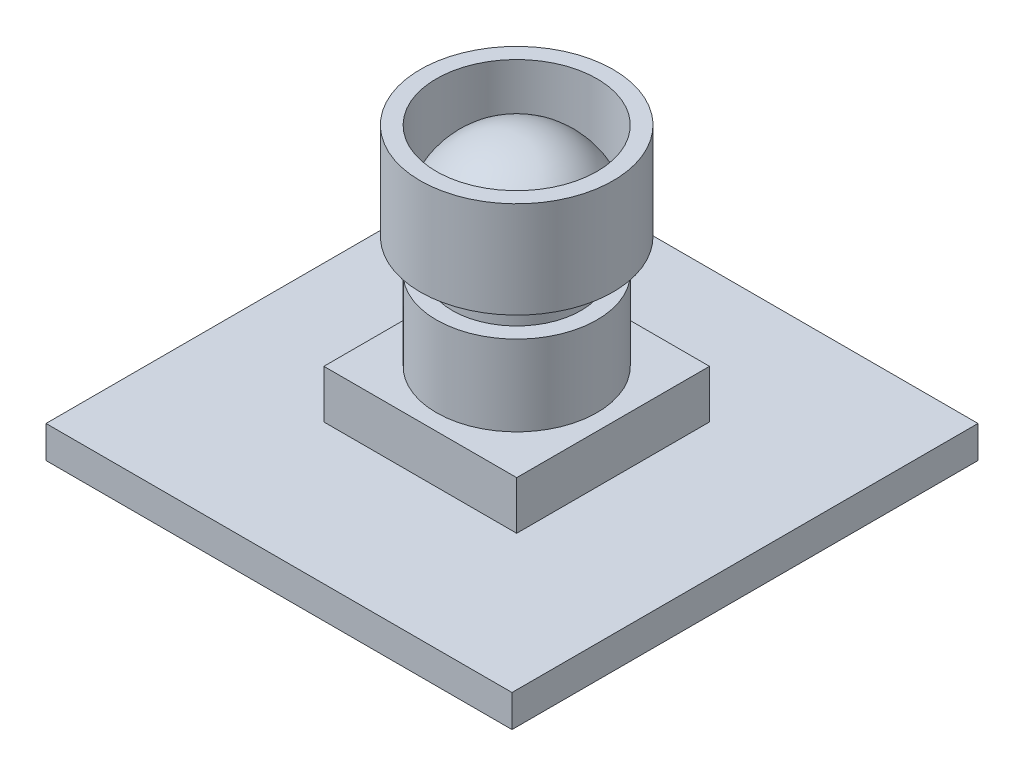
ISO-10303-21;
HEADER;
FILE_DESCRIPTION(('STEP AP214'),'2;1');
FILE_NAME('part.step','',(''),(''),'','','');
FILE_SCHEMA(('AUTOMOTIVE_DESIGN { 1 0 10303 214 1 1 1 1 }'));
ENDSEC;
DATA;
#1=APPLICATION_CONTEXT('core data for automotive mechanical design processes');
#2=APPLICATION_PROTOCOL_DEFINITION('international standard','automotive_design',2000,#1);
#3=PRODUCT_CONTEXT('',#1,'mechanical');
#4=PRODUCT('Part','Part','',(#3));
#5=PRODUCT_RELATED_PRODUCT_CATEGORY('part','',(#4));
#6=PRODUCT_DEFINITION_FORMATION('','',#4);
#7=PRODUCT_DEFINITION_CONTEXT('part definition',#1,'design');
#8=PRODUCT_DEFINITION('design','',#6,#7);
#9=PRODUCT_DEFINITION_SHAPE('','',#8);
#10=(LENGTH_UNIT() NAMED_UNIT(*) SI_UNIT(.MILLI.,.METRE.));
#11=(NAMED_UNIT(*) PLANE_ANGLE_UNIT() SI_UNIT($,.RADIAN.));
#12=(NAMED_UNIT(*) SI_UNIT($,.STERADIAN.) SOLID_ANGLE_UNIT());
#13=UNCERTAINTY_MEASURE_WITH_UNIT(LENGTH_MEASURE(1.E-05),#10,'distance_accuracy_value','');
#14=(GEOMETRIC_REPRESENTATION_CONTEXT(3) GLOBAL_UNCERTAINTY_ASSIGNED_CONTEXT((#13)) GLOBAL_UNIT_ASSIGNED_CONTEXT((#10,
#11,#12)) REPRESENTATION_CONTEXT('',''));
#15=CARTESIAN_POINT('',(0.,0.,0.));
#16=DIRECTION('',(0.,0.,1.));
#17=DIRECTION('',(1.,0.,0.));
#18=AXIS2_PLACEMENT_3D('',#15,#16,#17);
#19=CARTESIAN_POINT('',(0.,2.,0.));
#20=DIRECTION('',(0.,-1.,0.));
#21=DIRECTION('',(0.,0.,-1.));
#22=AXIS2_PLACEMENT_3D('',#19,#20,#21);
#23=PLANE('',#22);
#24=DIRECTION('',(0.,0.,1.));
#25=VECTOR('',#24,1.);
#26=CARTESIAN_POINT('',(0.,2.,0.));
#27=LINE('',#26,#25);
#28=CARTESIAN_POINT('',(0.,2.,-29.));
#29=VERTEX_POINT('',#28);
#30=CARTESIAN_POINT('',(0.,2.,0.));
#31=VERTEX_POINT('',#30);
#32=EDGE_CURVE('E147',#29,#31,#27,.T.);
#33=ORIENTED_EDGE('',*,*,#32,.T.);
#34=DIRECTION('',(1.,0.,0.));
#35=VECTOR('',#34,1.);
#36=CARTESIAN_POINT('',(0.,2.,0.));
#37=LINE('',#36,#35);
#38=CARTESIAN_POINT('',(29.,2.,0.));
#39=VERTEX_POINT('',#38);
#40=EDGE_CURVE('E151',#31,#39,#37,.T.);
#41=ORIENTED_EDGE('',*,*,#40,.T.);
#42=DIRECTION('',(0.,0.,-1.));
#43=VECTOR('',#42,1.);
#44=CARTESIAN_POINT('',(29.,2.,0.));
#45=LINE('',#44,#43);
#46=CARTESIAN_POINT('',(29.,2.,-29.));
#47=VERTEX_POINT('',#46);
#48=EDGE_CURVE('E155',#39,#47,#45,.T.);
#49=ORIENTED_EDGE('',*,*,#48,.T.);
#50=DIRECTION('',(-1.,0.,0.));
#51=VECTOR('',#50,1.);
#52=CARTESIAN_POINT('',(0.,2.,-29.));
#53=LINE('',#52,#51);
#54=EDGE_CURVE('E158',#47,#29,#53,.T.);
#55=ORIENTED_EDGE('',*,*,#54,.T.);
#56=EDGE_LOOP('',(#33,#41,#49,#55));
#57=FACE_BOUND('',#56,.T.);
#58=DIRECTION('',(0.,0.,1.));
#59=VECTOR('',#58,1.);
#60=CARTESIAN_POINT('',(8.56637487316948,2.,-20.725607830169));
#61=LINE('',#60,#59);
#62=CARTESIAN_POINT('',(8.56637487316948,2.,-20.725607830169));
#63=VERTEX_POINT('',#62);
#64=CARTESIAN_POINT('',(8.56637487316948,2.,-8.72560783016905));
#65=VERTEX_POINT('',#64);
#66=EDGE_CURVE('E63',#63,#65,#61,.T.);
#67=ORIENTED_EDGE('',*,*,#66,.F.);
#68=DIRECTION('',(-1.,0.,0.));
#69=VECTOR('',#68,1.);
#70=CARTESIAN_POINT('',(8.56637487316948,2.,-20.725607830169));
#71=LINE('',#70,#69);
#72=CARTESIAN_POINT('',(20.5663748731695,2.,-20.725607830169));
#73=VERTEX_POINT('',#72);
#74=EDGE_CURVE('E67',#73,#63,#71,.T.);
#75=ORIENTED_EDGE('',*,*,#74,.F.);
#76=DIRECTION('',(0.,0.,-1.));
#77=VECTOR('',#76,1.);
#78=CARTESIAN_POINT('',(20.5663748731695,2.,-20.725607830169));
#79=LINE('',#78,#77);
#80=CARTESIAN_POINT('',(20.5663748731695,2.,-8.72560783016905));
#81=VERTEX_POINT('',#80);
#82=EDGE_CURVE('E204',#81,#73,#79,.T.);
#83=ORIENTED_EDGE('',*,*,#82,.F.);
#84=DIRECTION('',(1.,0.,0.));
#85=VECTOR('',#84,1.);
#86=CARTESIAN_POINT('',(8.56637487316948,2.,-8.72560783016905));
#87=LINE('',#86,#85);
#88=EDGE_CURVE('E201',#65,#81,#87,.T.);
#89=ORIENTED_EDGE('',*,*,#88,.F.);
#90=EDGE_LOOP('',(#67,#75,#83,#89));
#91=FACE_BOUND('',#90,.T.);
#92=ADVANCED_FACE('F45',(#57,#91),#23,.F.);
#93=CARTESIAN_POINT('',(0.,2.,0.));
#94=DIRECTION('',(1.,0.,0.));
#95=DIRECTION('',(0.,0.,-1.));
#96=AXIS2_PLACEMENT_3D('',#93,#94,#95);
#97=PLANE('',#96);
#98=DIRECTION('',(0.,0.,1.));
#99=VECTOR('',#98,1.);
#100=CARTESIAN_POINT('',(0.,0.,0.));
#101=LINE('',#100,#99);
#102=CARTESIAN_POINT('',(0.,0.,-29.));
#103=VERTEX_POINT('',#102);
#104=CARTESIAN_POINT('',(0.,0.,0.));
#105=VERTEX_POINT('',#104);
#106=EDGE_CURVE('E136',#103,#105,#101,.T.);
#107=ORIENTED_EDGE('',*,*,#106,.T.);
#108=DIRECTION('',(0.,-1.,0.));
#109=VECTOR('',#108,1.);
#110=CARTESIAN_POINT('',(0.,2.,0.));
#111=LINE('',#110,#109);
#112=EDGE_CURVE('E49',#31,#105,#111,.T.);
#113=ORIENTED_EDGE('',*,*,#112,.F.);
#114=ORIENTED_EDGE('',*,*,#32,.F.);
#115=DIRECTION('',(0.,-1.,0.));
#116=VECTOR('',#115,1.);
#117=CARTESIAN_POINT('',(0.,2.,-29.));
#118=LINE('',#117,#116);
#119=EDGE_CURVE('E160',#29,#103,#118,.T.);
#120=ORIENTED_EDGE('',*,*,#119,.T.);
#121=EDGE_LOOP('',(#107,#113,#114,#120));
#122=FACE_BOUND('',#121,.T.);
#123=ADVANCED_FACE('F47',(#122),#97,.F.);
#124=CARTESIAN_POINT('',(0.,2.,0.));
#125=DIRECTION('',(0.,0.,-1.));
#126=DIRECTION('',(-1.,0.,0.));
#127=AXIS2_PLACEMENT_3D('',#124,#125,#126);
#128=PLANE('',#127);
#129=DIRECTION('',(1.,0.,0.));
#130=VECTOR('',#129,1.);
#131=CARTESIAN_POINT('',(0.,0.,0.));
#132=LINE('',#131,#130);
#133=CARTESIAN_POINT('',(29.,0.,0.));
#134=VERTEX_POINT('',#133);
#135=EDGE_CURVE('E141',#105,#134,#132,.T.);
#136=ORIENTED_EDGE('',*,*,#135,.T.);
#137=DIRECTION('',(0.,-1.,0.));
#138=VECTOR('',#137,1.);
#139=CARTESIAN_POINT('',(29.,2.,0.));
#140=LINE('',#139,#138);
#141=EDGE_CURVE('E175',#39,#134,#140,.T.);
#142=ORIENTED_EDGE('',*,*,#141,.F.);
#143=ORIENTED_EDGE('',*,*,#40,.F.);
#144=ORIENTED_EDGE('',*,*,#112,.T.);
#145=EDGE_LOOP('',(#136,#142,#143,#144));
#146=FACE_BOUND('',#145,.T.);
#147=ADVANCED_FACE('F223',(#146),#128,.F.);
#148=CARTESIAN_POINT('',(29.,2.,0.));
#149=DIRECTION('',(-1.,0.,0.));
#150=DIRECTION('',(0.,0.,1.));
#151=AXIS2_PLACEMENT_3D('',#148,#149,#150);
#152=PLANE('',#151);
#153=DIRECTION('',(0.,0.,-1.));
#154=VECTOR('',#153,1.);
#155=CARTESIAN_POINT('',(29.,0.,0.));
#156=LINE('',#155,#154);
#157=CARTESIAN_POINT('',(29.,0.,-29.));
#158=VERTEX_POINT('',#157);
#159=EDGE_CURVE('E164',#134,#158,#156,.T.);
#160=ORIENTED_EDGE('',*,*,#159,.T.);
#161=DIRECTION('',(0.,-1.,0.));
#162=VECTOR('',#161,1.);
#163=CARTESIAN_POINT('',(29.,2.,-29.));
#164=LINE('',#163,#162);
#165=EDGE_CURVE('E172',#47,#158,#164,.T.);
#166=ORIENTED_EDGE('',*,*,#165,.F.);
#167=ORIENTED_EDGE('',*,*,#48,.F.);
#168=ORIENTED_EDGE('',*,*,#141,.T.);
#169=EDGE_LOOP('',(#160,#166,#167,#168));
#170=FACE_BOUND('',#169,.T.);
#171=ADVANCED_FACE('F235',(#170),#152,.F.);
#172=CARTESIAN_POINT('',(0.,2.,-29.));
#173=DIRECTION('',(0.,0.,1.));
#174=DIRECTION('',(1.,0.,0.));
#175=AXIS2_PLACEMENT_3D('',#172,#173,#174);
#176=PLANE('',#175);
#177=DIRECTION('',(-1.,0.,0.));
#178=VECTOR('',#177,1.);
#179=CARTESIAN_POINT('',(0.,0.,-29.));
#180=LINE('',#179,#178);
#181=EDGE_CURVE('E152',#158,#103,#180,.T.);
#182=ORIENTED_EDGE('',*,*,#181,.T.);
#183=ORIENTED_EDGE('',*,*,#119,.F.);
#184=ORIENTED_EDGE('',*,*,#54,.F.);
#185=ORIENTED_EDGE('',*,*,#165,.T.);
#186=EDGE_LOOP('',(#182,#183,#184,#185));
#187=FACE_BOUND('',#186,.T.);
#188=ADVANCED_FACE('F231',(#187),#176,.F.);
#189=CARTESIAN_POINT('',(0.,0.,0.));
#190=DIRECTION('',(0.,-1.,0.));
#191=DIRECTION('',(0.,0.,-1.));
#192=AXIS2_PLACEMENT_3D('',#189,#190,#191);
#193=PLANE('',#192);
#194=ORIENTED_EDGE('',*,*,#106,.F.);
#195=ORIENTED_EDGE('',*,*,#181,.F.);
#196=ORIENTED_EDGE('',*,*,#159,.F.);
#197=ORIENTED_EDGE('',*,*,#135,.F.);
#198=EDGE_LOOP('',(#194,#195,#196,#197));
#199=FACE_BOUND('',#198,.T.);
#200=ADVANCED_FACE('F228',(#199),#193,.T.);
#201=CARTESIAN_POINT('',(8.56637487316948,5.,-20.725607830169));
#202=DIRECTION('',(1.,0.,0.));
#203=DIRECTION('',(0.,0.,-1.));
#204=AXIS2_PLACEMENT_3D('',#201,#202,#203);
#205=PLANE('',#204);
#206=ORIENTED_EDGE('',*,*,#66,.T.);
#207=DIRECTION('',(0.,-1.,0.));
#208=VECTOR('',#207,1.);
#209=CARTESIAN_POINT('',(8.56637487316948,5.,-8.72560783016905));
#210=LINE('',#209,#208);
#211=CARTESIAN_POINT('',(8.56637487316948,5.,-8.72560783016905));
#212=VERTEX_POINT('',#211);
#213=EDGE_CURVE('E116',#212,#65,#210,.T.);
#214=ORIENTED_EDGE('',*,*,#213,.F.);
#215=DIRECTION('',(0.,0.,1.));
#216=VECTOR('',#215,1.);
#217=CARTESIAN_POINT('',(8.56637487316948,5.,-20.725607830169));
#218=LINE('',#217,#216);
#219=CARTESIAN_POINT('',(8.56637487316948,5.,-20.725607830169));
#220=VERTEX_POINT('',#219);
#221=EDGE_CURVE('E123',#220,#212,#218,.T.);
#222=ORIENTED_EDGE('',*,*,#221,.F.);
#223=DIRECTION('',(0.,-1.,0.));
#224=VECTOR('',#223,1.);
#225=CARTESIAN_POINT('',(8.56637487316948,5.,-20.725607830169));
#226=LINE('',#225,#224);
#227=EDGE_CURVE('E198',#220,#63,#226,.T.);
#228=ORIENTED_EDGE('',*,*,#227,.T.);
#229=EDGE_LOOP('',(#206,#214,#222,#228));
#230=FACE_BOUND('',#229,.T.);
#231=ADVANCED_FACE('F134',(#230),#205,.F.);
#232=CARTESIAN_POINT('',(8.56637487316948,5.,-8.72560783016905));
#233=DIRECTION('',(0.,0.,-1.));
#234=DIRECTION('',(-1.,0.,0.));
#235=AXIS2_PLACEMENT_3D('',#232,#233,#234);
#236=PLANE('',#235);
#237=ORIENTED_EDGE('',*,*,#88,.T.);
#238=DIRECTION('',(0.,-1.,0.));
#239=VECTOR('',#238,1.);
#240=CARTESIAN_POINT('',(20.5663748731695,5.,-8.72560783016905));
#241=LINE('',#240,#239);
#242=CARTESIAN_POINT('',(20.5663748731695,5.,-8.72560783016905));
#243=VERTEX_POINT('',#242);
#244=EDGE_CURVE('E118',#243,#81,#241,.T.);
#245=ORIENTED_EDGE('',*,*,#244,.F.);
#246=DIRECTION('',(1.,0.,0.));
#247=VECTOR('',#246,1.);
#248=CARTESIAN_POINT('',(8.56637487316948,5.,-8.72560783016905));
#249=LINE('',#248,#247);
#250=EDGE_CURVE('E111',#212,#243,#249,.T.);
#251=ORIENTED_EDGE('',*,*,#250,.F.);
#252=ORIENTED_EDGE('',*,*,#213,.T.);
#253=EDGE_LOOP('',(#237,#245,#251,#252));
#254=FACE_BOUND('',#253,.T.);
#255=ADVANCED_FACE('F114',(#254),#236,.F.);
#256=CARTESIAN_POINT('',(20.5663748731695,5.,-20.725607830169));
#257=DIRECTION('',(-1.,0.,0.));
#258=DIRECTION('',(0.,0.,1.));
#259=AXIS2_PLACEMENT_3D('',#256,#257,#258);
#260=PLANE('',#259);
#261=ORIENTED_EDGE('',*,*,#82,.T.);
#262=DIRECTION('',(0.,-1.,0.));
#263=VECTOR('',#262,1.);
#264=CARTESIAN_POINT('',(20.5663748731695,5.,-20.725607830169));
#265=LINE('',#264,#263);
#266=CARTESIAN_POINT('',(20.5663748731695,5.,-20.725607830169));
#267=VERTEX_POINT('',#266);
#268=EDGE_CURVE('E143',#267,#73,#265,.T.);
#269=ORIENTED_EDGE('',*,*,#268,.F.);
#270=DIRECTION('',(0.,0.,-1.));
#271=VECTOR('',#270,1.);
#272=CARTESIAN_POINT('',(20.5663748731695,5.,-20.725607830169));
#273=LINE('',#272,#271);
#274=EDGE_CURVE('E122',#243,#267,#273,.T.);
#275=ORIENTED_EDGE('',*,*,#274,.F.);
#276=ORIENTED_EDGE('',*,*,#244,.T.);
#277=EDGE_LOOP('',(#261,#269,#275,#276));
#278=FACE_BOUND('',#277,.T.);
#279=ADVANCED_FACE('F216',(#278),#260,.F.);
#280=CARTESIAN_POINT('',(8.56637487316948,5.,-20.725607830169));
#281=DIRECTION('',(0.,0.,1.));
#282=DIRECTION('',(1.,0.,0.));
#283=AXIS2_PLACEMENT_3D('',#280,#281,#282);
#284=PLANE('',#283);
#285=ORIENTED_EDGE('',*,*,#74,.T.);
#286=ORIENTED_EDGE('',*,*,#227,.F.);
#287=DIRECTION('',(-1.,0.,0.));
#288=VECTOR('',#287,1.);
#289=CARTESIAN_POINT('',(8.56637487316948,5.,-20.725607830169));
#290=LINE('',#289,#288);
#291=EDGE_CURVE('E128',#267,#220,#290,.T.);
#292=ORIENTED_EDGE('',*,*,#291,.F.);
#293=ORIENTED_EDGE('',*,*,#268,.T.);
#294=EDGE_LOOP('',(#285,#286,#292,#293));
#295=FACE_BOUND('',#294,.T.);
#296=ADVANCED_FACE('F214',(#295),#284,.F.);
#297=CARTESIAN_POINT('',(0.,5.,0.));
#298=DIRECTION('',(0.,1.,0.));
#299=DIRECTION('',(0.,0.,1.));
#300=AXIS2_PLACEMENT_3D('',#297,#298,#299);
#301=PLANE('',#300);
#302=CARTESIAN_POINT('',(14.5663748731695,5.,-14.725607830169));
#303=DIRECTION('',(0.,1.,0.));
#304=DIRECTION('',(0.,0.,1.));
#305=AXIS2_PLACEMENT_3D('',#302,#303,#304);
#306=CIRCLE('',#305,5.);
#307=CARTESIAN_POINT('',(14.5663748731695,5.,-9.72560783016905));
#308=VERTEX_POINT('',#307);
#309=EDGE_CURVE('E55',#308,#308,#306,.T.);
#310=ORIENTED_EDGE('',*,*,#309,.F.);
#311=EDGE_LOOP('',(#310));
#312=FACE_BOUND('',#311,.T.);
#313=ORIENTED_EDGE('',*,*,#221,.T.);
#314=ORIENTED_EDGE('',*,*,#250,.T.);
#315=ORIENTED_EDGE('',*,*,#274,.T.);
#316=ORIENTED_EDGE('',*,*,#291,.T.);
#317=EDGE_LOOP('',(#313,#314,#315,#316));
#318=FACE_BOUND('',#317,.T.);
#319=ADVANCED_FACE('F126',(#312,#318),#301,.T.);
#320=CARTESIAN_POINT('',(14.5663748731695,10.,-14.725607830169));
#321=DIRECTION('',(0.,-1.,0.));
#322=DIRECTION('',(0.,0.,-1.));
#323=AXIS2_PLACEMENT_3D('',#320,#321,#322);
#324=CYLINDRICAL_SURFACE('',#323,5.);
#325=CARTESIAN_POINT('',(14.5663748731695,10.,-14.725607830169));
#326=DIRECTION('',(0.,1.,0.));
#327=DIRECTION('',(0.,0.,1.));
#328=AXIS2_PLACEMENT_3D('',#325,#326,#327);
#329=CIRCLE('',#328,5.);
#330=CARTESIAN_POINT('',(14.5663748731695,10.,-9.72560783016905));
#331=VERTEX_POINT('',#330);
#332=EDGE_CURVE('E192',#331,#331,#329,.T.);
#333=ORIENTED_EDGE('',*,*,#332,.F.);
#334=EDGE_LOOP('',(#333));
#335=FACE_BOUND('',#334,.T.);
#336=ORIENTED_EDGE('',*,*,#309,.T.);
#337=EDGE_LOOP('',(#336));
#338=FACE_BOUND('',#337,.T.);
#339=ADVANCED_FACE('F289',(#335,#338),#324,.T.);
#340=CARTESIAN_POINT('',(14.5663748731695,10.,-14.725607830169));
#341=DIRECTION('',(0.,1.,0.));
#342=DIRECTION('',(0.,0.,1.));
#343=AXIS2_PLACEMENT_3D('',#340,#341,#342);
#344=PLANE('',#343);
#345=CARTESIAN_POINT('',(14.5663748731695,10.,-14.725607830169));
#346=DIRECTION('',(0.,1.,0.));
#347=DIRECTION('',(0.,0.,1.));
#348=AXIS2_PLACEMENT_3D('',#345,#346,#347);
#349=CIRCLE('',#348,4.);
#350=CARTESIAN_POINT('',(14.5663748731695,10.,-10.7256078301691));
#351=VERTEX_POINT('',#350);
#352=EDGE_CURVE('E12',#351,#351,#349,.T.);
#353=ORIENTED_EDGE('',*,*,#352,.F.);
#354=EDGE_LOOP('',(#353));
#355=FACE_BOUND('',#354,.T.);
#356=ORIENTED_EDGE('',*,*,#332,.T.);
#357=EDGE_LOOP('',(#356));
#358=FACE_BOUND('',#357,.T.);
#359=ADVANCED_FACE('F297',(#355,#358),#344,.T.);
#360=CARTESIAN_POINT('',(14.5663748731695,12.,-14.725607830169));
#361=DIRECTION('',(0.,-1.,0.));
#362=DIRECTION('',(0.,0.,-1.));
#363=AXIS2_PLACEMENT_3D('',#360,#361,#362);
#364=CYLINDRICAL_SURFACE('',#363,4.);
#365=CARTESIAN_POINT('',(14.5663748731695,12.,-14.725607830169));
#366=DIRECTION('',(0.,1.,0.));
#367=DIRECTION('',(0.,0.,1.));
#368=AXIS2_PLACEMENT_3D('',#365,#366,#367);
#369=CIRCLE('',#368,4.);
#370=CARTESIAN_POINT('',(14.5663748731695,12.,-10.7256078301691));
#371=VERTEX_POINT('',#370);
#372=EDGE_CURVE('E416',#371,#371,#369,.T.);
#373=ORIENTED_EDGE('',*,*,#372,.F.);
#374=EDGE_LOOP('',(#373));
#375=FACE_BOUND('',#374,.T.);
#376=ORIENTED_EDGE('',*,*,#352,.T.);
#377=EDGE_LOOP('',(#376));
#378=FACE_BOUND('',#377,.T.);
#379=ADVANCED_FACE('F305',(#375,#378),#364,.T.);
#380=CARTESIAN_POINT('',(14.5663748731695,12.,-14.725607830169));
#381=DIRECTION('',(0.,1.,0.));
#382=DIRECTION('',(0.,0.,1.));
#383=AXIS2_PLACEMENT_3D('',#380,#381,#382);
#384=PLANE('',#383);
#385=ORIENTED_EDGE('',*,*,#372,.T.);
#386=EDGE_LOOP('',(#385));
#387=FACE_BOUND('',#386,.T.);
#388=CARTESIAN_POINT('',(14.5663748731695,12.,-14.725607830169));
#389=DIRECTION('',(0.,1.,0.));
#390=DIRECTION('',(0.,0.,1.));
#391=AXIS2_PLACEMENT_3D('',#388,#389,#390);
#392=CIRCLE('',#391,6.);
#393=CARTESIAN_POINT('',(14.5663748731695,12.,-8.72560783016905));
#394=VERTEX_POINT('',#393);
#395=EDGE_CURVE('E409',#394,#394,#392,.T.);
#396=ORIENTED_EDGE('',*,*,#395,.F.);
#397=EDGE_LOOP('',(#396));
#398=FACE_BOUND('',#397,.T.);
#399=ADVANCED_FACE('F313',(#387,#398),#384,.F.);
#400=CARTESIAN_POINT('',(14.5663748731695,18.,-14.725607830169));
#401=DIRECTION('',(0.,1.,0.));
#402=DIRECTION('',(0.,0.,1.));
#403=AXIS2_PLACEMENT_3D('',#400,#401,#402);
#404=PLANE('',#403);
#405=CARTESIAN_POINT('',(14.5663748731695,18.,-14.725607830169));
#406=DIRECTION('',(0.,1.,0.));
#407=DIRECTION('',(0.,0.,1.));
#408=AXIS2_PLACEMENT_3D('',#405,#406,#407);
#409=CIRCLE('',#408,6.);
#410=CARTESIAN_POINT('',(14.5663748731695,18.,-8.72560783016905));
#411=VERTEX_POINT('',#410);
#412=EDGE_CURVE('E412',#411,#411,#409,.T.);
#413=ORIENTED_EDGE('',*,*,#412,.T.);
#414=EDGE_LOOP('',(#413));
#415=FACE_BOUND('',#414,.T.);
#416=CARTESIAN_POINT('',(14.5663748731695,18.,-14.725607830169));
#417=DIRECTION('',(0.,1.,0.));
#418=DIRECTION('',(1.,0.,0.));
#419=AXIS2_PLACEMENT_3D('',#416,#417,#418);
#420=CIRCLE('',#419,5.);
#421=CARTESIAN_POINT('',(19.5663748731695,18.,-14.725607830169));
#422=VERTEX_POINT('',#421);
#423=EDGE_CURVE('E405',#422,#422,#420,.T.);
#424=ORIENTED_EDGE('',*,*,#423,.F.);
#425=EDGE_LOOP('',(#424));
#426=FACE_BOUND('',#425,.T.);
#427=ADVANCED_FACE('F321',(#415,#426),#404,.T.);
#428=CARTESIAN_POINT('',(14.5663748731695,18.,-14.725607830169));
#429=DIRECTION('',(0.,-1.,0.));
#430=DIRECTION('',(0.,0.,-1.));
#431=AXIS2_PLACEMENT_3D('',#428,#429,#430);
#432=CYLINDRICAL_SURFACE('',#431,6.);
#433=ORIENTED_EDGE('',*,*,#412,.F.);
#434=EDGE_LOOP('',(#433));
#435=FACE_BOUND('',#434,.T.);
#436=ORIENTED_EDGE('',*,*,#395,.T.);
#437=EDGE_LOOP('',(#436));
#438=FACE_BOUND('',#437,.T.);
#439=ADVANCED_FACE('F329',(#435,#438),#432,.T.);
#440=CARTESIAN_POINT('',(14.5663748731695,18.,-14.725607830169));
#441=DIRECTION('',(0.,-1.,0.));
#442=DIRECTION('',(0.,0.,-1.));
#443=AXIS2_PLACEMENT_3D('',#440,#441,#442);
#444=CYLINDRICAL_SURFACE('',#443,5.);
#445=CARTESIAN_POINT('',(14.5663748731695,12.5,-14.725607830169));
#446=DIRECTION('',(0.,-1.,0.));
#447=DIRECTION('',(-0.624027318014371,0.,0.781402525189029));
#448=AXIS2_PLACEMENT_3D('',#445,#446,#447);
#449=CIRCLE('',#448,5.);
#450=CARTESIAN_POINT('',(11.4462382830976,12.5,-10.8185952042239));
#451=VERTEX_POINT('',#450);
#452=EDGE_CURVE('E403',#451,#451,#449,.T.);
#453=ORIENTED_EDGE('',*,*,#452,.T.);
#454=EDGE_LOOP('',(#453));
#455=FACE_BOUND('',#454,.T.);
#456=ORIENTED_EDGE('',*,*,#423,.T.);
#457=EDGE_LOOP('',(#456));
#458=FACE_BOUND('',#457,.T.);
#459=ADVANCED_FACE('F337',(#455,#458),#444,.F.);
#460=CARTESIAN_POINT('',(14.5663748731695,12.5,-14.725607830169));
#461=DIRECTION('',(-0.943769708453558,0.,-0.330603595572531));
#462=DIRECTION('',(0.330603595572531,0.,-0.943769708453558));
#463=AXIS2_PLACEMENT_3D('',#460,#461,#462);
#464=SPHERICAL_SURFACE('',#463,5.);
#465=CARTESIAN_POINT('',(14.5663748731695,12.5,-14.725607830169));
#466=DIRECTION('',(0.,-1.,0.));
#467=DIRECTION('',(-0.624027318014371,0.,0.781402525189029));
#468=AXIS2_PLACEMENT_3D('',#465,#466,#467);
#469=SPHERICAL_SURFACE('',#468,5.);
#470=ORIENTED_EDGE('',*,*,#452,.F.);
#471=EDGE_LOOP('',(#470));
#472=FACE_BOUND('',#471,.T.);
#473=ADVANCED_FACE('F345',(#472),#469,.T.);
#474=CLOSED_SHELL('',(#92,#123,#147,#171,#188,#200,#231,#255,#279,#296,#319,#339,#359,#379,#399,
#427,#439,#459,#473));
#475=MANIFOLD_SOLID_BREP('B2',#474);
#476=ADVANCED_BREP_SHAPE_REPRESENTATION('',(#18,#475),#14);
#477=SHAPE_DEFINITION_REPRESENTATION(#9,#476);
ENDSEC;
END-ISO-10303-21;
